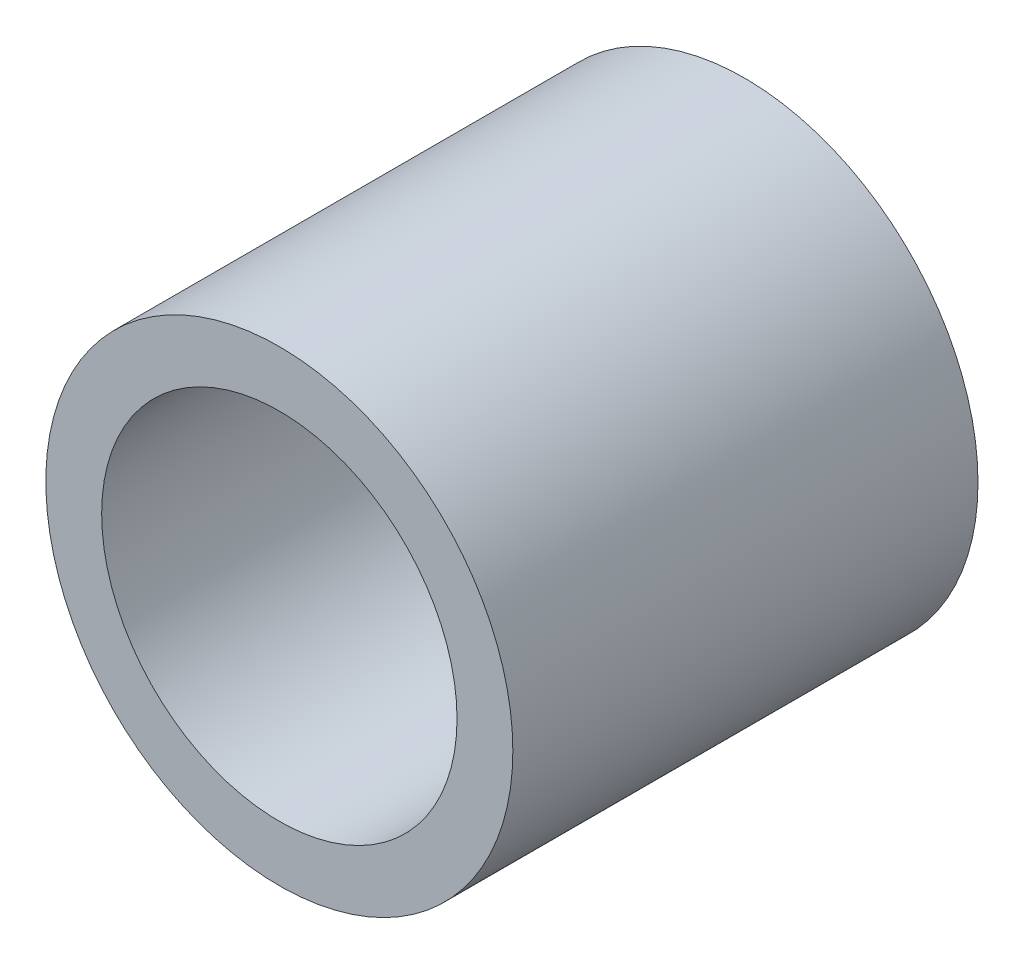
ISO-10303-21;
HEADER;
FILE_DESCRIPTION(('STEP AP214'),'2;1');
FILE_NAME('part.step','',(''),(''),'','','');
FILE_SCHEMA(('AUTOMOTIVE_DESIGN { 1 0 10303 214 1 1 1 1 }'));
ENDSEC;
DATA;
#1=APPLICATION_CONTEXT('core data for automotive mechanical design processes');
#2=APPLICATION_PROTOCOL_DEFINITION('international standard','automotive_design',2000,#1);
#3=PRODUCT_CONTEXT('',#1,'mechanical');
#4=PRODUCT('Part','Part','',(#3));
#5=PRODUCT_RELATED_PRODUCT_CATEGORY('part','',(#4));
#6=PRODUCT_DEFINITION_FORMATION('','',#4);
#7=PRODUCT_DEFINITION_CONTEXT('part definition',#1,'design');
#8=PRODUCT_DEFINITION('design','',#6,#7);
#9=PRODUCT_DEFINITION_SHAPE('','',#8);
#10=(LENGTH_UNIT() NAMED_UNIT(*) SI_UNIT(.MILLI.,.METRE.));
#11=(NAMED_UNIT(*) PLANE_ANGLE_UNIT() SI_UNIT($,.RADIAN.));
#12=(NAMED_UNIT(*) SI_UNIT($,.STERADIAN.) SOLID_ANGLE_UNIT());
#13=UNCERTAINTY_MEASURE_WITH_UNIT(LENGTH_MEASURE(1.E-05),#10,'distance_accuracy_value','');
#14=(GEOMETRIC_REPRESENTATION_CONTEXT(3) GLOBAL_UNCERTAINTY_ASSIGNED_CONTEXT((#13)) GLOBAL_UNIT_ASSIGNED_CONTEXT((#10,
#11,#12)) REPRESENTATION_CONTEXT('',''));
#15=CARTESIAN_POINT('',(0.,0.,0.));
#16=DIRECTION('',(0.,0.,1.));
#17=DIRECTION('',(1.,0.,0.));
#18=AXIS2_PLACEMENT_3D('',#15,#16,#17);
#19=CARTESIAN_POINT('',(0.,0.,3.175));
#20=DIRECTION('',(0.,0.,1.));
#21=DIRECTION('',(1.,0.,0.));
#22=AXIS2_PLACEMENT_3D('',#19,#20,#21);
#23=PLANE('',#22);
#24=CARTESIAN_POINT('',(0.,0.,3.175));
#25=DIRECTION('',(0.,0.,1.));
#26=DIRECTION('',(1.,0.,0.));
#27=AXIS2_PLACEMENT_3D('',#24,#25,#26);
#28=CIRCLE('',#27,3.1877);
#29=CARTESIAN_POINT('',(3.1877,0.,3.175));
#30=VERTEX_POINT('',#29);
#31=EDGE_CURVE('E10',#30,#30,#28,.T.);
#32=ORIENTED_EDGE('',*,*,#31,.T.);
#33=EDGE_LOOP('',(#32));
#34=FACE_BOUND('',#33,.T.);
#35=CARTESIAN_POINT('',(0.,0.,3.175));
#36=DIRECTION('',(0.,0.,1.));
#37=DIRECTION('',(1.,0.,0.));
#38=AXIS2_PLACEMENT_3D('',#35,#36,#37);
#39=CIRCLE('',#38,2.4257);
#40=CARTESIAN_POINT('',(2.4257,0.,3.175));
#41=VERTEX_POINT('',#40);
#42=EDGE_CURVE('E43',#41,#41,#39,.T.);
#43=ORIENTED_EDGE('',*,*,#42,.F.);
#44=EDGE_LOOP('',(#43));
#45=FACE_BOUND('',#44,.T.);
#46=ADVANCED_FACE('F32',(#34,#45),#23,.T.);
#47=CARTESIAN_POINT('',(0.,0.,-3.175));
#48=DIRECTION('',(0.,0.,1.));
#49=DIRECTION('',(1.,0.,0.));
#50=AXIS2_PLACEMENT_3D('',#47,#48,#49);
#51=PLANE('',#50);
#52=CARTESIAN_POINT('',(0.,0.,-3.175));
#53=DIRECTION('',(0.,0.,1.));
#54=DIRECTION('',(1.,0.,0.));
#55=AXIS2_PLACEMENT_3D('',#52,#53,#54);
#56=CIRCLE('',#55,3.1877);
#57=CARTESIAN_POINT('',(3.1877,0.,-3.175));
#58=VERTEX_POINT('',#57);
#59=EDGE_CURVE('E36',#58,#58,#56,.T.);
#60=ORIENTED_EDGE('',*,*,#59,.F.);
#61=EDGE_LOOP('',(#60));
#62=FACE_BOUND('',#61,.T.);
#63=CARTESIAN_POINT('',(0.,0.,-3.175));
#64=DIRECTION('',(0.,0.,1.));
#65=DIRECTION('',(1.,0.,0.));
#66=AXIS2_PLACEMENT_3D('',#63,#64,#65);
#67=CIRCLE('',#66,2.4257);
#68=CARTESIAN_POINT('',(2.4257,0.,-3.175));
#69=VERTEX_POINT('',#68);
#70=EDGE_CURVE('E45',#69,#69,#67,.T.);
#71=ORIENTED_EDGE('',*,*,#70,.T.);
#72=EDGE_LOOP('',(#71));
#73=FACE_BOUND('',#72,.T.);
#74=ADVANCED_FACE('F55',(#62,#73),#51,.F.);
#75=CARTESIAN_POINT('',(0.,0.,3.175));
#76=DIRECTION('',(0.,0.,-1.));
#77=DIRECTION('',(-1.,0.,0.));
#78=AXIS2_PLACEMENT_3D('',#75,#76,#77);
#79=CYLINDRICAL_SURFACE('',#78,3.1877);
#80=ORIENTED_EDGE('',*,*,#31,.F.);
#81=EDGE_LOOP('',(#80));
#82=FACE_BOUND('',#81,.T.);
#83=ORIENTED_EDGE('',*,*,#59,.T.);
#84=EDGE_LOOP('',(#83));
#85=FACE_BOUND('',#84,.T.);
#86=ADVANCED_FACE('F34',(#82,#85),#79,.T.);
#87=CARTESIAN_POINT('',(0.,0.,3.175));
#88=DIRECTION('',(0.,0.,-1.));
#89=DIRECTION('',(-1.,0.,0.));
#90=AXIS2_PLACEMENT_3D('',#87,#88,#89);
#91=CYLINDRICAL_SURFACE('',#90,2.4257);
#92=ORIENTED_EDGE('',*,*,#42,.T.);
#93=EDGE_LOOP('',(#92));
#94=FACE_BOUND('',#93,.T.);
#95=ORIENTED_EDGE('',*,*,#70,.F.);
#96=EDGE_LOOP('',(#95));
#97=FACE_BOUND('',#96,.T.);
#98=ADVANCED_FACE('F51',(#94,#97),#91,.F.);
#99=CLOSED_SHELL('',(#46,#74,#86,#98));
#100=MANIFOLD_SOLID_BREP('B2',#99);
#101=ADVANCED_BREP_SHAPE_REPRESENTATION('',(#18,#100),#14);
#102=SHAPE_DEFINITION_REPRESENTATION(#9,#101);
ENDSEC;
END-ISO-10303-21;
